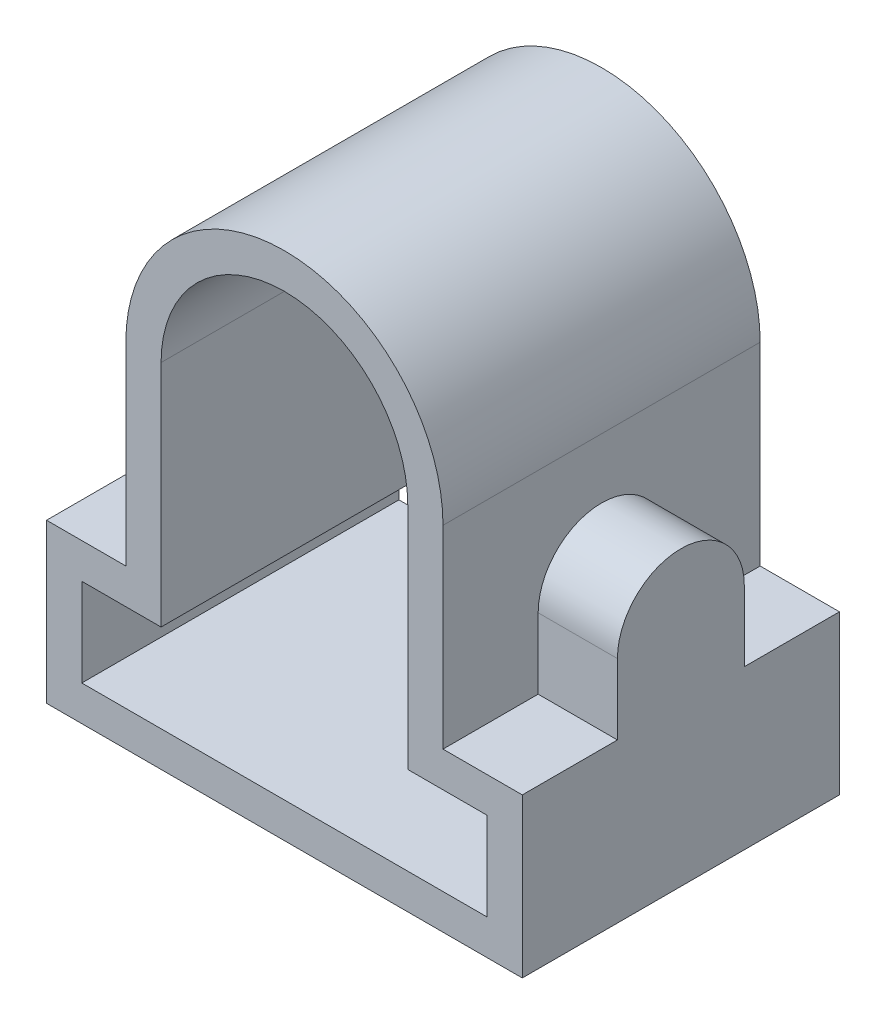
ISO-10303-21;
HEADER;
FILE_DESCRIPTION(('STEP AP214'),'2;1');
FILE_NAME('part.step','',(''),(''),'','','');
FILE_SCHEMA(('AUTOMOTIVE_DESIGN { 1 0 10303 214 1 1 1 1 }'));
ENDSEC;
DATA;
#1=APPLICATION_CONTEXT('core data for automotive mechanical design processes');
#2=APPLICATION_PROTOCOL_DEFINITION('international standard','automotive_design',2000,#1);
#3=PRODUCT_CONTEXT('',#1,'mechanical');
#4=PRODUCT('Part','Part','',(#3));
#5=PRODUCT_RELATED_PRODUCT_CATEGORY('part','',(#4));
#6=PRODUCT_DEFINITION_FORMATION('','',#4);
#7=PRODUCT_DEFINITION_CONTEXT('part definition',#1,'design');
#8=PRODUCT_DEFINITION('design','',#6,#7);
#9=PRODUCT_DEFINITION_SHAPE('','',#8);
#10=(LENGTH_UNIT() NAMED_UNIT(*) SI_UNIT(.MILLI.,.METRE.));
#11=(NAMED_UNIT(*) PLANE_ANGLE_UNIT() SI_UNIT($,.RADIAN.));
#12=(NAMED_UNIT(*) SI_UNIT($,.STERADIAN.) SOLID_ANGLE_UNIT());
#13=UNCERTAINTY_MEASURE_WITH_UNIT(LENGTH_MEASURE(1.E-05),#10,'distance_accuracy_value','');
#14=(GEOMETRIC_REPRESENTATION_CONTEXT(3) GLOBAL_UNCERTAINTY_ASSIGNED_CONTEXT((#13)) GLOBAL_UNIT_ASSIGNED_CONTEXT((#10,
#11,#12)) REPRESENTATION_CONTEXT('',''));
#15=CARTESIAN_POINT('',(0.,0.,0.));
#16=DIRECTION('',(0.,0.,1.));
#17=DIRECTION('',(1.,0.,0.));
#18=AXIS2_PLACEMENT_3D('',#15,#16,#17);
#19=CARTESIAN_POINT('',(67.5,45.,45.));
#20=DIRECTION('',(0.,-1.,0.));
#21=DIRECTION('',(0.,0.,-1.));
#22=AXIS2_PLACEMENT_3D('',#19,#20,#21);
#23=PLANE('',#22);
#24=DIRECTION('',(-1.,0.,0.));
#25=VECTOR('',#24,1.);
#26=CARTESIAN_POINT('',(119.84500931321,45.,18.));
#27=LINE('',#26,#25);
#28=CARTESIAN_POINT('',(67.5,45.,18.));
#29=VERTEX_POINT('',#28);
#30=CARTESIAN_POINT('',(45.,45.,18.));
#31=VERTEX_POINT('',#30);
#32=EDGE_CURVE('E200',#29,#31,#27,.T.);
#33=ORIENTED_EDGE('',*,*,#32,.T.);
#34=DIRECTION('',(0.,0.,-1.));
#35=VECTOR('',#34,1.);
#36=CARTESIAN_POINT('',(45.,45.,45.));
#37=LINE('',#36,#35);
#38=CARTESIAN_POINT('',(45.,45.,45.));
#39=VERTEX_POINT('',#38);
#40=EDGE_CURVE('E11',#39,#31,#37,.T.);
#41=ORIENTED_EDGE('',*,*,#40,.F.);
#42=DIRECTION('',(-1.,0.,0.));
#43=VECTOR('',#42,1.);
#44=CARTESIAN_POINT('',(67.5,45.,45.));
#45=LINE('',#44,#43);
#46=CARTESIAN_POINT('',(67.5,45.,45.));
#47=VERTEX_POINT('',#46);
#48=EDGE_CURVE('E295',#47,#39,#45,.T.);
#49=ORIENTED_EDGE('',*,*,#48,.F.);
#50=DIRECTION('',(0.,0.,-1.));
#51=VECTOR('',#50,1.);
#52=CARTESIAN_POINT('',(67.5,45.,45.));
#53=LINE('',#52,#51);
#54=EDGE_CURVE('E345',#47,#29,#53,.T.);
#55=ORIENTED_EDGE('',*,*,#54,.T.);
#56=EDGE_LOOP('',(#33,#41,#49,#55));
#57=FACE_BOUND('',#56,.T.);
#58=ADVANCED_FACE('F45',(#57),#23,.F.);
#59=DIRECTION('',(-1.,0.,0.));
#60=VECTOR('',#59,1.);
#61=CARTESIAN_POINT('',(119.84500931321,45.,-18.));
#62=LINE('',#61,#60);
#63=CARTESIAN_POINT('',(67.5,45.,-18.));
#64=VERTEX_POINT('',#63);
#65=CARTESIAN_POINT('',(45.,45.,-18.));
#66=VERTEX_POINT('',#65);
#67=EDGE_CURVE('E204',#64,#66,#62,.T.);
#68=ORIENTED_EDGE('',*,*,#67,.F.);
#69=CARTESIAN_POINT('',(67.5,45.,-45.));
#70=VERTEX_POINT('',#69);
#71=EDGE_CURVE('E321',#64,#70,#53,.T.);
#72=ORIENTED_EDGE('',*,*,#71,.T.);
#73=DIRECTION('',(-1.,0.,0.));
#74=VECTOR('',#73,1.);
#75=CARTESIAN_POINT('',(67.5,45.,-45.));
#76=LINE('',#75,#74);
#77=CARTESIAN_POINT('',(45.,45.,-45.));
#78=VERTEX_POINT('',#77);
#79=EDGE_CURVE('E294',#70,#78,#76,.T.);
#80=ORIENTED_EDGE('',*,*,#79,.T.);
#81=EDGE_CURVE('E53',#66,#78,#37,.T.);
#82=ORIENTED_EDGE('',*,*,#81,.F.);
#83=EDGE_LOOP('',(#68,#72,#80,#82));
#84=FACE_BOUND('',#83,.T.);
#85=ADVANCED_FACE('F388',(#84),#23,.F.);
#86=CARTESIAN_POINT('',(45.,45.,45.));
#87=DIRECTION('',(-1.,0.,0.));
#88=DIRECTION('',(0.,0.,1.));
#89=AXIS2_PLACEMENT_3D('',#86,#87,#88);
#90=PLANE('',#89);
#91=DIRECTION('',(0.,-1.,0.));
#92=VECTOR('',#91,1.);
#93=CARTESIAN_POINT('',(45.,45.,18.));
#94=LINE('',#93,#92);
#95=CARTESIAN_POINT('',(45.,65.,18.));
#96=VERTEX_POINT('',#95);
#97=EDGE_CURVE('E59',#96,#31,#94,.T.);
#98=ORIENTED_EDGE('',*,*,#97,.F.);
#99=CARTESIAN_POINT('',(45.,65.,0.));
#100=DIRECTION('',(1.,0.,0.));
#101=DIRECTION('',(0.,0.,1.));
#102=AXIS2_PLACEMENT_3D('',#99,#100,#101);
#103=CIRCLE('',#102,18.);
#104=CARTESIAN_POINT('',(45.,65.,-18.));
#105=VERTEX_POINT('',#104);
#106=EDGE_CURVE('E64',#105,#96,#103,.T.);
#107=ORIENTED_EDGE('',*,*,#106,.F.);
#108=DIRECTION('',(0.,1.,0.));
#109=VECTOR('',#108,1.);
#110=CARTESIAN_POINT('',(45.,65.,-18.));
#111=LINE('',#110,#109);
#112=EDGE_CURVE('E379',#66,#105,#111,.T.);
#113=ORIENTED_EDGE('',*,*,#112,.F.);
#114=ORIENTED_EDGE('',*,*,#81,.T.);
#115=DIRECTION('',(0.,1.,0.));
#116=VECTOR('',#115,1.);
#117=CARTESIAN_POINT('',(45.,45.,-45.));
#118=LINE('',#117,#116);
#119=CARTESIAN_POINT('',(45.,100.,-45.));
#120=VERTEX_POINT('',#119);
#121=EDGE_CURVE('E325',#78,#120,#118,.T.);
#122=ORIENTED_EDGE('',*,*,#121,.T.);
#123=DIRECTION('',(0.,0.,-1.));
#124=VECTOR('',#123,1.);
#125=CARTESIAN_POINT('',(45.,100.,45.));
#126=LINE('',#125,#124);
#127=CARTESIAN_POINT('',(45.,100.,45.));
#128=VERTEX_POINT('',#127);
#129=EDGE_CURVE('E367',#128,#120,#126,.T.);
#130=ORIENTED_EDGE('',*,*,#129,.F.);
#131=DIRECTION('',(0.,1.,0.));
#132=VECTOR('',#131,1.);
#133=CARTESIAN_POINT('',(45.,45.,45.));
#134=LINE('',#133,#132);
#135=EDGE_CURVE('E299',#39,#128,#134,.T.);
#136=ORIENTED_EDGE('',*,*,#135,.F.);
#137=ORIENTED_EDGE('',*,*,#40,.T.);
#138=EDGE_LOOP('',(#98,#107,#113,#114,#122,#130,#136,#137));
#139=FACE_BOUND('',#138,.T.);
#140=ADVANCED_FACE('F377',(#139),#90,.F.);
#141=CARTESIAN_POINT('',(0.,100.,45.));
#142=DIRECTION('',(0.,0.,1.));
#143=DIRECTION('',(1.,0.,0.));
#144=AXIS2_PLACEMENT_3D('',#141,#142,#143);
#145=PLANE('',#144);
#146=ORIENTED_EDGE('',*,*,#48,.T.);
#147=ORIENTED_EDGE('',*,*,#135,.T.);
#148=CARTESIAN_POINT('',(0.,100.,45.));
#149=DIRECTION('',(0.,0.,1.));
#150=DIRECTION('',(1.,0.,0.));
#151=AXIS2_PLACEMENT_3D('',#148,#149,#150);
#152=CIRCLE('',#151,45.);
#153=CARTESIAN_POINT('',(-45.,100.,45.));
#154=VERTEX_POINT('',#153);
#155=EDGE_CURVE('E303',#128,#154,#152,.T.);
#156=ORIENTED_EDGE('',*,*,#155,.T.);
#157=DIRECTION('',(0.,-1.,0.));
#158=VECTOR('',#157,1.);
#159=CARTESIAN_POINT('',(-45.,45.,45.));
#160=LINE('',#159,#158);
#161=CARTESIAN_POINT('',(-45.,45.,45.));
#162=VERTEX_POINT('',#161);
#163=EDGE_CURVE('E306',#154,#162,#160,.T.);
#164=ORIENTED_EDGE('',*,*,#163,.T.);
#165=DIRECTION('',(-1.,0.,0.));
#166=VECTOR('',#165,1.);
#167=CARTESIAN_POINT('',(-67.5,45.,45.));
#168=LINE('',#167,#166);
#169=CARTESIAN_POINT('',(-67.5,45.,45.));
#170=VERTEX_POINT('',#169);
#171=EDGE_CURVE('E309',#162,#170,#168,.T.);
#172=ORIENTED_EDGE('',*,*,#171,.T.);
#173=DIRECTION('',(0.,-1.,0.));
#174=VECTOR('',#173,1.);
#175=CARTESIAN_POINT('',(-67.5,0.,45.));
#176=LINE('',#175,#174);
#177=CARTESIAN_POINT('',(-67.5,0.,45.));
#178=VERTEX_POINT('',#177);
#179=EDGE_CURVE('E312',#170,#178,#176,.T.);
#180=ORIENTED_EDGE('',*,*,#179,.T.);
#181=DIRECTION('',(1.,0.,0.));
#182=VECTOR('',#181,1.);
#183=CARTESIAN_POINT('',(-67.5,0.,45.));
#184=LINE('',#183,#182);
#185=CARTESIAN_POINT('',(67.5,0.,45.));
#186=VERTEX_POINT('',#185);
#187=EDGE_CURVE('E315',#178,#186,#184,.T.);
#188=ORIENTED_EDGE('',*,*,#187,.T.);
#189=DIRECTION('',(0.,1.,0.));
#190=VECTOR('',#189,1.);
#191=CARTESIAN_POINT('',(67.5,0.,45.));
#192=LINE('',#191,#190);
#193=EDGE_CURVE('E318',#186,#47,#192,.T.);
#194=ORIENTED_EDGE('',*,*,#193,.T.);
#195=EDGE_LOOP('',(#146,#147,#156,#164,#172,#180,#188,#194));
#196=FACE_BOUND('',#195,.T.);
#197=DIRECTION('',(0.,-1.,0.));
#198=VECTOR('',#197,1.);
#199=CARTESIAN_POINT('',(-35.,35.,45.));
#200=LINE('',#199,#198);
#201=CARTESIAN_POINT('',(-35.,100.,45.));
#202=VERTEX_POINT('',#201);
#203=CARTESIAN_POINT('',(-35.,35.,45.));
#204=VERTEX_POINT('',#203);
#205=EDGE_CURVE('E214',#202,#204,#200,.T.);
#206=ORIENTED_EDGE('',*,*,#205,.F.);
#207=CARTESIAN_POINT('',(0.,100.,45.));
#208=DIRECTION('',(0.,0.,1.));
#209=DIRECTION('',(1.,0.,0.));
#210=AXIS2_PLACEMENT_3D('',#207,#208,#209);
#211=CIRCLE('',#210,35.);
#212=CARTESIAN_POINT('',(35.,100.,45.));
#213=VERTEX_POINT('',#212);
#214=EDGE_CURVE('E211',#213,#202,#211,.T.);
#215=ORIENTED_EDGE('',*,*,#214,.F.);
#216=DIRECTION('',(0.,1.,0.));
#217=VECTOR('',#216,1.);
#218=CARTESIAN_POINT('',(35.,35.,45.));
#219=LINE('',#218,#217);
#220=CARTESIAN_POINT('',(35.,35.,45.));
#221=VERTEX_POINT('',#220);
#222=EDGE_CURVE('E234',#221,#213,#219,.T.);
#223=ORIENTED_EDGE('',*,*,#222,.F.);
#224=DIRECTION('',(-1.,0.,0.));
#225=VECTOR('',#224,1.);
#226=CARTESIAN_POINT('',(57.5,35.,45.));
#227=LINE('',#226,#225);
#228=CARTESIAN_POINT('',(57.5,35.,45.));
#229=VERTEX_POINT('',#228);
#230=EDGE_CURVE('E230',#229,#221,#227,.T.);
#231=ORIENTED_EDGE('',*,*,#230,.F.);
#232=DIRECTION('',(0.,1.,0.));
#233=VECTOR('',#232,1.);
#234=CARTESIAN_POINT('',(57.5,10.,45.));
#235=LINE('',#234,#233);
#236=CARTESIAN_POINT('',(57.5,10.,45.));
#237=VERTEX_POINT('',#236);
#238=EDGE_CURVE('E227',#237,#229,#235,.T.);
#239=ORIENTED_EDGE('',*,*,#238,.F.);
#240=DIRECTION('',(1.,0.,0.));
#241=VECTOR('',#240,1.);
#242=CARTESIAN_POINT('',(-57.5,10.,45.));
#243=LINE('',#242,#241);
#244=CARTESIAN_POINT('',(-57.5,10.,45.));
#245=VERTEX_POINT('',#244);
#246=EDGE_CURVE('E224',#245,#237,#243,.T.);
#247=ORIENTED_EDGE('',*,*,#246,.F.);
#248=DIRECTION('',(0.,-1.,0.));
#249=VECTOR('',#248,1.);
#250=CARTESIAN_POINT('',(-57.5,10.,45.));
#251=LINE('',#250,#249);
#252=CARTESIAN_POINT('',(-57.5,35.,45.));
#253=VERTEX_POINT('',#252);
#254=EDGE_CURVE('E221',#253,#245,#251,.T.);
#255=ORIENTED_EDGE('',*,*,#254,.F.);
#256=DIRECTION('',(-1.,0.,0.));
#257=VECTOR('',#256,1.);
#258=CARTESIAN_POINT('',(-57.5,35.,45.));
#259=LINE('',#258,#257);
#260=EDGE_CURVE('E218',#204,#253,#259,.T.);
#261=ORIENTED_EDGE('',*,*,#260,.F.);
#262=EDGE_LOOP('',(#206,#215,#223,#231,#239,#247,#255,#261));
#263=FACE_BOUND('',#262,.T.);
#264=ADVANCED_FACE('F413',(#196,#263),#145,.T.);
#265=CARTESIAN_POINT('',(0.,100.,-45.));
#266=DIRECTION('',(0.,0.,1.));
#267=DIRECTION('',(1.,0.,0.));
#268=AXIS2_PLACEMENT_3D('',#265,#266,#267);
#269=PLANE('',#268);
#270=ORIENTED_EDGE('',*,*,#79,.F.);
#271=DIRECTION('',(0.,1.,0.));
#272=VECTOR('',#271,1.);
#273=CARTESIAN_POINT('',(67.5,0.,-45.));
#274=LINE('',#273,#272);
#275=CARTESIAN_POINT('',(67.5,0.,-45.));
#276=VERTEX_POINT('',#275);
#277=EDGE_CURVE('E300',#276,#70,#274,.T.);
#278=ORIENTED_EDGE('',*,*,#277,.F.);
#279=DIRECTION('',(1.,0.,0.));
#280=VECTOR('',#279,1.);
#281=CARTESIAN_POINT('',(-67.5,0.,-45.));
#282=LINE('',#281,#280);
#283=CARTESIAN_POINT('',(-67.5,0.,-45.));
#284=VERTEX_POINT('',#283);
#285=EDGE_CURVE('E340',#284,#276,#282,.T.);
#286=ORIENTED_EDGE('',*,*,#285,.F.);
#287=DIRECTION('',(0.,-1.,0.));
#288=VECTOR('',#287,1.);
#289=CARTESIAN_POINT('',(-67.5,0.,-45.));
#290=LINE('',#289,#288);
#291=CARTESIAN_POINT('',(-67.5,45.,-45.));
#292=VERTEX_POINT('',#291);
#293=EDGE_CURVE('E337',#292,#284,#290,.T.);
#294=ORIENTED_EDGE('',*,*,#293,.F.);
#295=DIRECTION('',(-1.,0.,0.));
#296=VECTOR('',#295,1.);
#297=CARTESIAN_POINT('',(-67.5,45.,-45.));
#298=LINE('',#297,#296);
#299=CARTESIAN_POINT('',(-45.,45.,-45.));
#300=VERTEX_POINT('',#299);
#301=EDGE_CURVE('E334',#300,#292,#298,.T.);
#302=ORIENTED_EDGE('',*,*,#301,.F.);
#303=DIRECTION('',(0.,-1.,0.));
#304=VECTOR('',#303,1.);
#305=CARTESIAN_POINT('',(-45.,45.,-45.));
#306=LINE('',#305,#304);
#307=CARTESIAN_POINT('',(-45.,100.,-45.));
#308=VERTEX_POINT('',#307);
#309=EDGE_CURVE('E331',#308,#300,#306,.T.);
#310=ORIENTED_EDGE('',*,*,#309,.F.);
#311=CARTESIAN_POINT('',(0.,100.,-45.));
#312=DIRECTION('',(0.,0.,1.));
#313=DIRECTION('',(1.,0.,0.));
#314=AXIS2_PLACEMENT_3D('',#311,#312,#313);
#315=CIRCLE('',#314,45.);
#316=EDGE_CURVE('E328',#120,#308,#315,.T.);
#317=ORIENTED_EDGE('',*,*,#316,.F.);
#318=ORIENTED_EDGE('',*,*,#121,.F.);
#319=EDGE_LOOP('',(#270,#278,#286,#294,#302,#310,#317,#318));
#320=FACE_BOUND('',#319,.T.);
#321=CARTESIAN_POINT('',(0.,100.,-45.));
#322=DIRECTION('',(0.,0.,1.));
#323=DIRECTION('',(1.,0.,0.));
#324=AXIS2_PLACEMENT_3D('',#321,#322,#323);
#325=CIRCLE('',#324,35.);
#326=CARTESIAN_POINT('',(35.,100.,-45.));
#327=VERTEX_POINT('',#326);
#328=CARTESIAN_POINT('',(-35.,100.,-45.));
#329=VERTEX_POINT('',#328);
#330=EDGE_CURVE('E238',#327,#329,#325,.T.);
#331=ORIENTED_EDGE('',*,*,#330,.T.);
#332=DIRECTION('',(0.,-1.,0.));
#333=VECTOR('',#332,1.);
#334=CARTESIAN_POINT('',(-35.,35.,-45.));
#335=LINE('',#334,#333);
#336=CARTESIAN_POINT('',(-35.,35.,-45.));
#337=VERTEX_POINT('',#336);
#338=EDGE_CURVE('E242',#329,#337,#335,.T.);
#339=ORIENTED_EDGE('',*,*,#338,.T.);
#340=DIRECTION('',(-1.,0.,0.));
#341=VECTOR('',#340,1.);
#342=CARTESIAN_POINT('',(-57.5,35.,-45.));
#343=LINE('',#342,#341);
#344=CARTESIAN_POINT('',(-57.5,35.,-45.));
#345=VERTEX_POINT('',#344);
#346=EDGE_CURVE('E246',#337,#345,#343,.T.);
#347=ORIENTED_EDGE('',*,*,#346,.T.);
#348=DIRECTION('',(0.,-1.,0.));
#349=VECTOR('',#348,1.);
#350=CARTESIAN_POINT('',(-57.5,10.,-45.));
#351=LINE('',#350,#349);
#352=CARTESIAN_POINT('',(-57.5,10.,-45.));
#353=VERTEX_POINT('',#352);
#354=EDGE_CURVE('E250',#345,#353,#351,.T.);
#355=ORIENTED_EDGE('',*,*,#354,.T.);
#356=DIRECTION('',(1.,0.,0.));
#357=VECTOR('',#356,1.);
#358=CARTESIAN_POINT('',(-57.5,10.,-45.));
#359=LINE('',#358,#357);
#360=CARTESIAN_POINT('',(57.5,10.,-45.));
#361=VERTEX_POINT('',#360);
#362=EDGE_CURVE('E254',#353,#361,#359,.T.);
#363=ORIENTED_EDGE('',*,*,#362,.T.);
#364=DIRECTION('',(0.,1.,0.));
#365=VECTOR('',#364,1.);
#366=CARTESIAN_POINT('',(57.5,10.,-45.));
#367=LINE('',#366,#365);
#368=CARTESIAN_POINT('',(57.5,35.,-45.));
#369=VERTEX_POINT('',#368);
#370=EDGE_CURVE('E258',#361,#369,#367,.T.);
#371=ORIENTED_EDGE('',*,*,#370,.T.);
#372=DIRECTION('',(-1.,0.,0.));
#373=VECTOR('',#372,1.);
#374=CARTESIAN_POINT('',(57.5,35.,-45.));
#375=LINE('',#374,#373);
#376=CARTESIAN_POINT('',(35.,35.,-45.));
#377=VERTEX_POINT('',#376);
#378=EDGE_CURVE('E262',#369,#377,#375,.T.);
#379=ORIENTED_EDGE('',*,*,#378,.T.);
#380=DIRECTION('',(0.,1.,0.));
#381=VECTOR('',#380,1.);
#382=CARTESIAN_POINT('',(35.,35.,-45.));
#383=LINE('',#382,#381);
#384=EDGE_CURVE('E215',#377,#327,#383,.T.);
#385=ORIENTED_EDGE('',*,*,#384,.T.);
#386=EDGE_LOOP('',(#331,#339,#347,#355,#363,#371,#379,#385));
#387=FACE_BOUND('',#386,.T.);
#388=ADVANCED_FACE('F384',(#320,#387),#269,.F.);
#389=CARTESIAN_POINT('',(0.,100.,45.));
#390=DIRECTION('',(0.,0.,-1.));
#391=DIRECTION('',(-1.,0.,0.));
#392=AXIS2_PLACEMENT_3D('',#389,#390,#391);
#393=CYLINDRICAL_SURFACE('',#392,45.);
#394=ORIENTED_EDGE('',*,*,#316,.T.);
#395=DIRECTION('',(0.,0.,-1.));
#396=VECTOR('',#395,1.);
#397=CARTESIAN_POINT('',(-45.,100.,45.));
#398=LINE('',#397,#396);
#399=EDGE_CURVE('E364',#154,#308,#398,.T.);
#400=ORIENTED_EDGE('',*,*,#399,.F.);
#401=ORIENTED_EDGE('',*,*,#155,.F.);
#402=ORIENTED_EDGE('',*,*,#129,.T.);
#403=EDGE_LOOP('',(#394,#400,#401,#402));
#404=FACE_BOUND('',#403,.T.);
#405=ADVANCED_FACE('F411',(#404),#393,.T.);
#406=CARTESIAN_POINT('',(-45.,45.,45.));
#407=DIRECTION('',(1.,0.,0.));
#408=DIRECTION('',(0.,0.,-1.));
#409=AXIS2_PLACEMENT_3D('',#406,#407,#408);
#410=PLANE('',#409);
#411=ORIENTED_EDGE('',*,*,#309,.T.);
#412=DIRECTION('',(0.,0.,-1.));
#413=VECTOR('',#412,1.);
#414=CARTESIAN_POINT('',(-45.,45.,45.));
#415=LINE('',#414,#413);
#416=EDGE_CURVE('E360',#162,#300,#415,.T.);
#417=ORIENTED_EDGE('',*,*,#416,.F.);
#418=ORIENTED_EDGE('',*,*,#163,.F.);
#419=ORIENTED_EDGE('',*,*,#399,.T.);
#420=EDGE_LOOP('',(#411,#417,#418,#419));
#421=FACE_BOUND('',#420,.T.);
#422=ADVANCED_FACE('F408',(#421),#410,.F.);
#423=CARTESIAN_POINT('',(-67.5,45.,45.));
#424=DIRECTION('',(0.,-1.,0.));
#425=DIRECTION('',(0.,0.,-1.));
#426=AXIS2_PLACEMENT_3D('',#423,#424,#425);
#427=PLANE('',#426);
#428=ORIENTED_EDGE('',*,*,#301,.T.);
#429=DIRECTION('',(0.,0.,-1.));
#430=VECTOR('',#429,1.);
#431=CARTESIAN_POINT('',(-67.5,45.,45.));
#432=LINE('',#431,#430);
#433=EDGE_CURVE('E356',#170,#292,#432,.T.);
#434=ORIENTED_EDGE('',*,*,#433,.F.);
#435=ORIENTED_EDGE('',*,*,#171,.F.);
#436=ORIENTED_EDGE('',*,*,#416,.T.);
#437=EDGE_LOOP('',(#428,#434,#435,#436));
#438=FACE_BOUND('',#437,.T.);
#439=ADVANCED_FACE('F405',(#438),#427,.F.);
#440=CARTESIAN_POINT('',(-67.5,0.,45.));
#441=DIRECTION('',(1.,0.,0.));
#442=DIRECTION('',(0.,0.,-1.));
#443=AXIS2_PLACEMENT_3D('',#440,#441,#442);
#444=PLANE('',#443);
#445=ORIENTED_EDGE('',*,*,#293,.T.);
#446=DIRECTION('',(0.,0.,-1.));
#447=VECTOR('',#446,1.);
#448=CARTESIAN_POINT('',(-67.5,0.,45.));
#449=LINE('',#448,#447);
#450=EDGE_CURVE('E352',#178,#284,#449,.T.);
#451=ORIENTED_EDGE('',*,*,#450,.F.);
#452=ORIENTED_EDGE('',*,*,#179,.F.);
#453=ORIENTED_EDGE('',*,*,#433,.T.);
#454=EDGE_LOOP('',(#445,#451,#452,#453));
#455=FACE_BOUND('',#454,.T.);
#456=ADVANCED_FACE('F401',(#455),#444,.F.);
#457=CARTESIAN_POINT('',(-67.5,0.,45.));
#458=DIRECTION('',(0.,1.,0.));
#459=DIRECTION('',(0.,0.,1.));
#460=AXIS2_PLACEMENT_3D('',#457,#458,#459);
#461=PLANE('',#460);
#462=ORIENTED_EDGE('',*,*,#285,.T.);
#463=DIRECTION('',(0.,0.,-1.));
#464=VECTOR('',#463,1.);
#465=CARTESIAN_POINT('',(67.5,0.,45.));
#466=LINE('',#465,#464);
#467=EDGE_CURVE('E348',#186,#276,#466,.T.);
#468=ORIENTED_EDGE('',*,*,#467,.F.);
#469=ORIENTED_EDGE('',*,*,#187,.F.);
#470=ORIENTED_EDGE('',*,*,#450,.T.);
#471=EDGE_LOOP('',(#462,#468,#469,#470));
#472=FACE_BOUND('',#471,.T.);
#473=ADVANCED_FACE('F396',(#472),#461,.F.);
#474=CARTESIAN_POINT('',(67.5,0.,45.));
#475=DIRECTION('',(-1.,0.,0.));
#476=DIRECTION('',(0.,0.,1.));
#477=AXIS2_PLACEMENT_3D('',#474,#475,#476);
#478=PLANE('',#477);
#479=ORIENTED_EDGE('',*,*,#277,.T.);
#480=ORIENTED_EDGE('',*,*,#71,.F.);
#481=DIRECTION('',(0.,-1.,0.));
#482=VECTOR('',#481,1.);
#483=CARTESIAN_POINT('',(67.5,65.,-18.));
#484=LINE('',#483,#482);
#485=CARTESIAN_POINT('',(67.5,65.,-18.));
#486=VERTEX_POINT('',#485);
#487=EDGE_CURVE('E190',#486,#64,#484,.T.);
#488=ORIENTED_EDGE('',*,*,#487,.F.);
#489=CARTESIAN_POINT('',(67.5,65.,0.));
#490=DIRECTION('',(-1.,0.,0.));
#491=DIRECTION('',(0.,0.,1.));
#492=AXIS2_PLACEMENT_3D('',#489,#490,#491);
#493=CIRCLE('',#492,18.);
#494=CARTESIAN_POINT('',(67.5,65.,18.));
#495=VERTEX_POINT('',#494);
#496=EDGE_CURVE('E181',#495,#486,#493,.T.);
#497=ORIENTED_EDGE('',*,*,#496,.F.);
#498=DIRECTION('',(0.,1.,0.));
#499=VECTOR('',#498,1.);
#500=CARTESIAN_POINT('',(67.5,45.,18.));
#501=LINE('',#500,#499);
#502=EDGE_CURVE('E187',#29,#495,#501,.T.);
#503=ORIENTED_EDGE('',*,*,#502,.F.);
#504=ORIENTED_EDGE('',*,*,#54,.F.);
#505=ORIENTED_EDGE('',*,*,#193,.F.);
#506=ORIENTED_EDGE('',*,*,#467,.T.);
#507=EDGE_LOOP('',(#479,#480,#488,#497,#503,#504,#505,#506));
#508=FACE_BOUND('',#507,.T.);
#509=ADVANCED_FACE('F184',(#508),#478,.F.);
#510=CARTESIAN_POINT('',(0.,100.,45.));
#511=DIRECTION('',(0.,0.,-1.));
#512=DIRECTION('',(-1.,0.,0.));
#513=AXIS2_PLACEMENT_3D('',#510,#511,#512);
#514=CYLINDRICAL_SURFACE('',#513,35.);
#515=ORIENTED_EDGE('',*,*,#330,.F.);
#516=DIRECTION('',(0.,0.,-1.));
#517=VECTOR('',#516,1.);
#518=CARTESIAN_POINT('',(35.,100.,45.));
#519=LINE('',#518,#517);
#520=EDGE_CURVE('E237',#213,#327,#519,.T.);
#521=ORIENTED_EDGE('',*,*,#520,.F.);
#522=ORIENTED_EDGE('',*,*,#214,.T.);
#523=DIRECTION('',(0.,0.,-1.));
#524=VECTOR('',#523,1.);
#525=CARTESIAN_POINT('',(-35.,100.,45.));
#526=LINE('',#525,#524);
#527=EDGE_CURVE('E290',#202,#329,#526,.T.);
#528=ORIENTED_EDGE('',*,*,#527,.T.);
#529=EDGE_LOOP('',(#515,#521,#522,#528));
#530=FACE_BOUND('',#529,.T.);
#531=ADVANCED_FACE('F463',(#530),#514,.F.);
#532=CARTESIAN_POINT('',(-35.,35.,45.));
#533=DIRECTION('',(1.,0.,0.));
#534=DIRECTION('',(0.,0.,-1.));
#535=AXIS2_PLACEMENT_3D('',#532,#533,#534);
#536=PLANE('',#535);
#537=ORIENTED_EDGE('',*,*,#338,.F.);
#538=ORIENTED_EDGE('',*,*,#527,.F.);
#539=ORIENTED_EDGE('',*,*,#205,.T.);
#540=DIRECTION('',(0.,0.,-1.));
#541=VECTOR('',#540,1.);
#542=CARTESIAN_POINT('',(-35.,35.,45.));
#543=LINE('',#542,#541);
#544=EDGE_CURVE('E287',#204,#337,#543,.T.);
#545=ORIENTED_EDGE('',*,*,#544,.T.);
#546=EDGE_LOOP('',(#537,#538,#539,#545));
#547=FACE_BOUND('',#546,.T.);
#548=ADVANCED_FACE('F468',(#547),#536,.T.);
#549=CARTESIAN_POINT('',(-57.5,35.,45.));
#550=DIRECTION('',(0.,-1.,0.));
#551=DIRECTION('',(0.,0.,-1.));
#552=AXIS2_PLACEMENT_3D('',#549,#550,#551);
#553=PLANE('',#552);
#554=ORIENTED_EDGE('',*,*,#346,.F.);
#555=ORIENTED_EDGE('',*,*,#544,.F.);
#556=ORIENTED_EDGE('',*,*,#260,.T.);
#557=DIRECTION('',(0.,0.,-1.));
#558=VECTOR('',#557,1.);
#559=CARTESIAN_POINT('',(-57.5,35.,45.));
#560=LINE('',#559,#558);
#561=EDGE_CURVE('E284',#253,#345,#560,.T.);
#562=ORIENTED_EDGE('',*,*,#561,.T.);
#563=EDGE_LOOP('',(#554,#555,#556,#562));
#564=FACE_BOUND('',#563,.T.);
#565=ADVANCED_FACE('F472',(#564),#553,.T.);
#566=CARTESIAN_POINT('',(-57.5,10.,45.));
#567=DIRECTION('',(1.,0.,0.));
#568=DIRECTION('',(0.,0.,-1.));
#569=AXIS2_PLACEMENT_3D('',#566,#567,#568);
#570=PLANE('',#569);
#571=ORIENTED_EDGE('',*,*,#354,.F.);
#572=ORIENTED_EDGE('',*,*,#561,.F.);
#573=ORIENTED_EDGE('',*,*,#254,.T.);
#574=DIRECTION('',(0.,0.,-1.));
#575=VECTOR('',#574,1.);
#576=CARTESIAN_POINT('',(-57.5,10.,45.));
#577=LINE('',#576,#575);
#578=EDGE_CURVE('E281',#245,#353,#577,.T.);
#579=ORIENTED_EDGE('',*,*,#578,.T.);
#580=EDGE_LOOP('',(#571,#572,#573,#579));
#581=FACE_BOUND('',#580,.T.);
#582=ADVANCED_FACE('F476',(#581),#570,.T.);
#583=CARTESIAN_POINT('',(-57.5,10.,45.));
#584=DIRECTION('',(0.,1.,0.));
#585=DIRECTION('',(0.,0.,1.));
#586=AXIS2_PLACEMENT_3D('',#583,#584,#585);
#587=PLANE('',#586);
#588=ORIENTED_EDGE('',*,*,#362,.F.);
#589=ORIENTED_EDGE('',*,*,#578,.F.);
#590=ORIENTED_EDGE('',*,*,#246,.T.);
#591=DIRECTION('',(0.,0.,-1.));
#592=VECTOR('',#591,1.);
#593=CARTESIAN_POINT('',(57.5,10.,45.));
#594=LINE('',#593,#592);
#595=EDGE_CURVE('E278',#237,#361,#594,.T.);
#596=ORIENTED_EDGE('',*,*,#595,.T.);
#597=EDGE_LOOP('',(#588,#589,#590,#596));
#598=FACE_BOUND('',#597,.T.);
#599=ADVANCED_FACE('F480',(#598),#587,.T.);
#600=CARTESIAN_POINT('',(57.5,10.,45.));
#601=DIRECTION('',(-1.,0.,0.));
#602=DIRECTION('',(0.,0.,1.));
#603=AXIS2_PLACEMENT_3D('',#600,#601,#602);
#604=PLANE('',#603);
#605=ORIENTED_EDGE('',*,*,#370,.F.);
#606=ORIENTED_EDGE('',*,*,#595,.F.);
#607=ORIENTED_EDGE('',*,*,#238,.T.);
#608=DIRECTION('',(0.,0.,-1.));
#609=VECTOR('',#608,1.);
#610=CARTESIAN_POINT('',(57.5,35.,45.));
#611=LINE('',#610,#609);
#612=EDGE_CURVE('E275',#229,#369,#611,.T.);
#613=ORIENTED_EDGE('',*,*,#612,.T.);
#614=EDGE_LOOP('',(#605,#606,#607,#613));
#615=FACE_BOUND('',#614,.T.);
#616=ADVANCED_FACE('F484',(#615),#604,.T.);
#617=CARTESIAN_POINT('',(57.5,35.,45.));
#618=DIRECTION('',(0.,-1.,0.));
#619=DIRECTION('',(0.,0.,-1.));
#620=AXIS2_PLACEMENT_3D('',#617,#618,#619);
#621=PLANE('',#620);
#622=ORIENTED_EDGE('',*,*,#378,.F.);
#623=ORIENTED_EDGE('',*,*,#612,.F.);
#624=ORIENTED_EDGE('',*,*,#230,.T.);
#625=DIRECTION('',(0.,0.,-1.));
#626=VECTOR('',#625,1.);
#627=CARTESIAN_POINT('',(35.,35.,45.));
#628=LINE('',#627,#626);
#629=EDGE_CURVE('E272',#221,#377,#628,.T.);
#630=ORIENTED_EDGE('',*,*,#629,.T.);
#631=EDGE_LOOP('',(#622,#623,#624,#630));
#632=FACE_BOUND('',#631,.T.);
#633=ADVANCED_FACE('F488',(#632),#621,.T.);
#634=CARTESIAN_POINT('',(35.,35.,45.));
#635=DIRECTION('',(-1.,0.,0.));
#636=DIRECTION('',(0.,0.,1.));
#637=AXIS2_PLACEMENT_3D('',#634,#635,#636);
#638=PLANE('',#637);
#639=ORIENTED_EDGE('',*,*,#384,.F.);
#640=ORIENTED_EDGE('',*,*,#629,.F.);
#641=ORIENTED_EDGE('',*,*,#222,.T.);
#642=ORIENTED_EDGE('',*,*,#520,.T.);
#643=EDGE_LOOP('',(#639,#640,#641,#642));
#644=FACE_BOUND('',#643,.T.);
#645=ADVANCED_FACE('F491',(#644),#638,.T.);
#646=CARTESIAN_POINT('',(119.84500931321,45.,18.));
#647=DIRECTION('',(0.,0.,-1.));
#648=DIRECTION('',(-1.,0.,0.));
#649=AXIS2_PLACEMENT_3D('',#646,#647,#648);
#650=PLANE('',#649);
#651=ORIENTED_EDGE('',*,*,#32,.F.);
#652=ORIENTED_EDGE('',*,*,#502,.T.);
#653=DIRECTION('',(-1.,0.,0.));
#654=VECTOR('',#653,1.);
#655=CARTESIAN_POINT('',(119.84500931321,65.,18.));
#656=LINE('',#655,#654);
#657=EDGE_CURVE('E195',#495,#96,#656,.T.);
#658=ORIENTED_EDGE('',*,*,#657,.T.);
#659=ORIENTED_EDGE('',*,*,#97,.T.);
#660=EDGE_LOOP('',(#651,#652,#658,#659));
#661=FACE_BOUND('',#660,.T.);
#662=ADVANCED_FACE('F202',(#661),#650,.F.);
#663=CARTESIAN_POINT('',(119.84500931321,65.,0.));
#664=DIRECTION('',(-1.,0.,0.));
#665=DIRECTION('',(0.,0.,1.));
#666=AXIS2_PLACEMENT_3D('',#663,#664,#665);
#667=CYLINDRICAL_SURFACE('',#666,18.);
#668=ORIENTED_EDGE('',*,*,#657,.F.);
#669=ORIENTED_EDGE('',*,*,#496,.T.);
#670=DIRECTION('',(-1.,0.,0.));
#671=VECTOR('',#670,1.);
#672=CARTESIAN_POINT('',(119.84500931321,65.,-18.));
#673=LINE('',#672,#671);
#674=EDGE_CURVE('E199',#486,#105,#673,.T.);
#675=ORIENTED_EDGE('',*,*,#674,.T.);
#676=ORIENTED_EDGE('',*,*,#106,.T.);
#677=EDGE_LOOP('',(#668,#669,#675,#676));
#678=FACE_BOUND('',#677,.T.);
#679=ADVANCED_FACE('F196',(#678),#667,.T.);
#680=CARTESIAN_POINT('',(119.84500931321,65.,-18.));
#681=DIRECTION('',(0.,0.,1.));
#682=DIRECTION('',(0.,-1.,0.));
#683=AXIS2_PLACEMENT_3D('',#680,#681,#682);
#684=PLANE('',#683);
#685=ORIENTED_EDGE('',*,*,#674,.F.);
#686=ORIENTED_EDGE('',*,*,#487,.T.);
#687=ORIENTED_EDGE('',*,*,#67,.T.);
#688=ORIENTED_EDGE('',*,*,#112,.T.);
#689=EDGE_LOOP('',(#685,#686,#687,#688));
#690=FACE_BOUND('',#689,.T.);
#691=ADVANCED_FACE('F427',(#690),#684,.F.);
#692=CLOSED_SHELL('',(#58,#85,#140,#264,#388,#405,#422,#439,#456,#473,#509,#531,#548,#565,#582,
#599,#616,#633,#645,#662,#679,#691));
#693=MANIFOLD_SOLID_BREP('B2',#692);
#694=ADVANCED_BREP_SHAPE_REPRESENTATION('',(#18,#693),#14);
#695=SHAPE_DEFINITION_REPRESENTATION(#9,#694);
ENDSEC;
END-ISO-10303-21;
